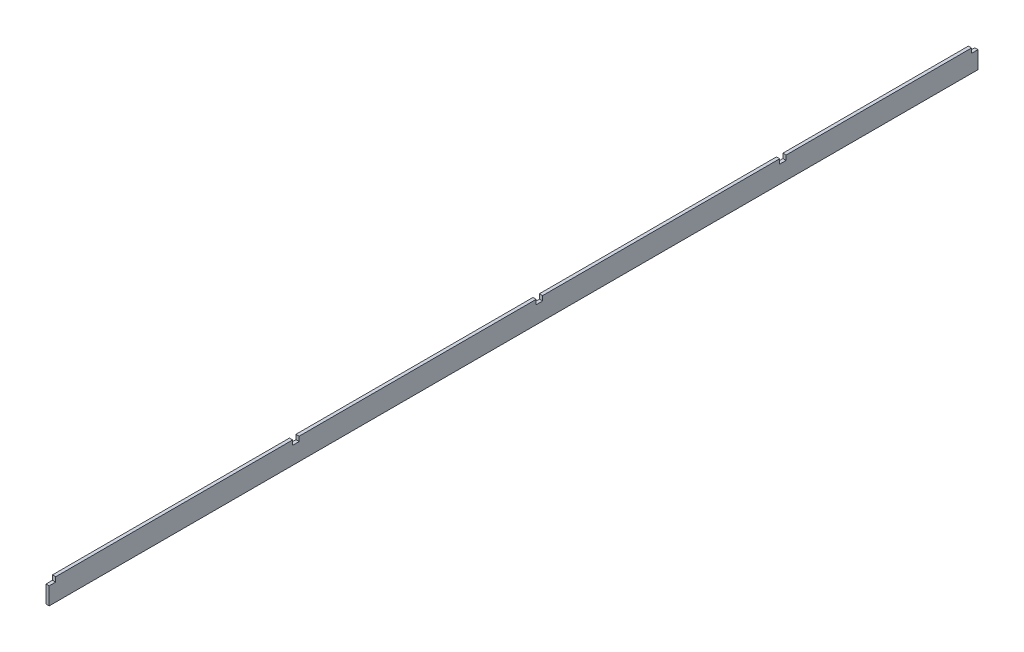
ISO-10303-21;
HEADER;
FILE_DESCRIPTION(('STEP AP214'),'2;1');
FILE_NAME('part.step','',(''),(''),'','','');
FILE_SCHEMA(('AUTOMOTIVE_DESIGN { 1 0 10303 214 1 1 1 1 }'));
ENDSEC;
DATA;
#1=APPLICATION_CONTEXT('core data for automotive mechanical design processes');
#2=APPLICATION_PROTOCOL_DEFINITION('international standard','automotive_design',2000,#1);
#3=PRODUCT_CONTEXT('',#1,'mechanical');
#4=PRODUCT('Part','Part','',(#3));
#5=PRODUCT_RELATED_PRODUCT_CATEGORY('part','',(#4));
#6=PRODUCT_DEFINITION_FORMATION('','',#4);
#7=PRODUCT_DEFINITION_CONTEXT('part definition',#1,'design');
#8=PRODUCT_DEFINITION('design','',#6,#7);
#9=PRODUCT_DEFINITION_SHAPE('','',#8);
#10=(LENGTH_UNIT() NAMED_UNIT(*) SI_UNIT(.MILLI.,.METRE.));
#11=(NAMED_UNIT(*) PLANE_ANGLE_UNIT() SI_UNIT($,.RADIAN.));
#12=(NAMED_UNIT(*) SI_UNIT($,.STERADIAN.) SOLID_ANGLE_UNIT());
#13=UNCERTAINTY_MEASURE_WITH_UNIT(LENGTH_MEASURE(1.E-05),#10,'distance_accuracy_value','');
#14=(GEOMETRIC_REPRESENTATION_CONTEXT(3) GLOBAL_UNCERTAINTY_ASSIGNED_CONTEXT((#13)) GLOBAL_UNIT_ASSIGNED_CONTEXT((#10,
#11,#12)) REPRESENTATION_CONTEXT('',''));
#15=CARTESIAN_POINT('',(0.,0.,0.));
#16=DIRECTION('',(0.,0.,1.));
#17=DIRECTION('',(1.,0.,0.));
#18=AXIS2_PLACEMENT_3D('',#15,#16,#17);
#19=CARTESIAN_POINT('',(795.106629248693,137.283876295924,123.03125));
#20=DIRECTION('',(0.,0.,-1.));
#21=DIRECTION('',(1.,0.,0.));
#22=AXIS2_PLACEMENT_3D('',#19,#20,#21);
#23=PLANE('',#22);
#24=DIRECTION('',(0.,1.,0.));
#25=VECTOR('',#24,1.);
#26=CARTESIAN_POINT('',(337.777897230405,137.283876295924,123.03125));
#27=LINE('',#26,#25);
#28=CARTESIAN_POINT('',(337.777897230405,137.283876295924,123.03125));
#29=VERTEX_POINT('',#28);
#30=CARTESIAN_POINT('',(337.777897230405,145.84143234043,123.03125));
#31=VERTEX_POINT('',#30);
#32=EDGE_CURVE('E245',#29,#31,#27,.T.);
#33=ORIENTED_EDGE('',*,*,#32,.T.);
#34=DIRECTION('',(-1.,0.,0.));
#35=VECTOR('',#34,1.);
#36=CARTESIAN_POINT('',(795.106629248693,145.84143234043,123.03125));
#37=LINE('',#36,#35);
#38=CARTESIAN_POINT('',(336.190397230405,145.84143234043,123.03125));
#39=VERTEX_POINT('',#38);
#40=EDGE_CURVE('E249',#31,#39,#37,.T.);
#41=ORIENTED_EDGE('',*,*,#40,.T.);
#42=DIRECTION('',(0.,1.,0.));
#43=VECTOR('',#42,1.);
#44=CARTESIAN_POINT('',(336.190397230405,137.283876295924,123.03125));
#45=LINE('',#44,#43);
#46=CARTESIAN_POINT('',(336.190397230405,137.283876295924,123.03125));
#47=VERTEX_POINT('',#46);
#48=EDGE_CURVE('E252',#47,#39,#45,.T.);
#49=ORIENTED_EDGE('',*,*,#48,.F.);
#50=DIRECTION('',(-1.,0.,0.));
#51=VECTOR('',#50,1.);
#52=CARTESIAN_POINT('',(795.106629248693,137.283876295924,123.03125));
#53=LINE('',#52,#51);
#54=EDGE_CURVE('E39',#29,#47,#53,.T.);
#55=ORIENTED_EDGE('',*,*,#54,.F.);
#56=EDGE_LOOP('',(#33,#41,#49,#55));
#57=FACE_BOUND('',#56,.T.);
#58=ADVANCED_FACE('F35',(#57),#23,.F.);
#59=CARTESIAN_POINT('',(795.106629248693,145.84143234043,123.03125));
#60=DIRECTION('',(0.,-1.,0.));
#61=DIRECTION('',(0.,0.,1.));
#62=AXIS2_PLACEMENT_3D('',#59,#60,#61);
#63=PLANE('',#62);
#64=DIRECTION('',(0.,0.,-1.));
#65=VECTOR('',#64,1.);
#66=CARTESIAN_POINT('',(337.777897230405,145.84143234043,123.03125));
#67=LINE('',#66,#65);
#68=CARTESIAN_POINT('',(337.777897230405,145.84143234043,119.85625));
#69=VERTEX_POINT('',#68);
#70=EDGE_CURVE('E148',#31,#69,#67,.T.);
#71=ORIENTED_EDGE('',*,*,#70,.T.);
#72=DIRECTION('',(-1.,0.,0.));
#73=VECTOR('',#72,1.);
#74=CARTESIAN_POINT('',(795.106629248693,145.84143234043,119.85625));
#75=LINE('',#74,#73);
#76=CARTESIAN_POINT('',(336.190397230405,145.84143234043,119.85625));
#77=VERTEX_POINT('',#76);
#78=EDGE_CURVE('E253',#69,#77,#75,.T.);
#79=ORIENTED_EDGE('',*,*,#78,.T.);
#80=DIRECTION('',(0.,0.,-1.));
#81=VECTOR('',#80,1.);
#82=CARTESIAN_POINT('',(336.190397230405,145.84143234043,123.03125));
#83=LINE('',#82,#81);
#84=EDGE_CURVE('E139',#39,#77,#83,.T.);
#85=ORIENTED_EDGE('',*,*,#84,.F.);
#86=ORIENTED_EDGE('',*,*,#40,.F.);
#87=EDGE_LOOP('',(#71,#79,#85,#86));
#88=FACE_BOUND('',#87,.T.);
#89=ADVANCED_FACE('F351',(#88),#63,.F.);
#90=CARTESIAN_POINT('',(795.106629248693,145.84143234043,119.85625));
#91=DIRECTION('',(0.,0.,-1.));
#92=DIRECTION('',(1.,0.,0.));
#93=AXIS2_PLACEMENT_3D('',#90,#91,#92);
#94=PLANE('',#93);
#95=DIRECTION('',(0.,1.,0.));
#96=VECTOR('',#95,1.);
#97=CARTESIAN_POINT('',(337.777897230405,145.84143234043,119.85625));
#98=LINE('',#97,#96);
#99=CARTESIAN_POINT('',(337.777897230405,148.134181796479,119.85625));
#100=VERTEX_POINT('',#99);
#101=EDGE_CURVE('E241',#69,#100,#98,.T.);
#102=ORIENTED_EDGE('',*,*,#101,.T.);
#103=DIRECTION('',(-1.,0.,0.));
#104=VECTOR('',#103,1.);
#105=CARTESIAN_POINT('',(795.106629248693,148.134181796479,119.85625));
#106=LINE('',#105,#104);
#107=CARTESIAN_POINT('',(336.190397230405,148.134181796479,119.85625));
#108=VERTEX_POINT('',#107);
#109=EDGE_CURVE('E256',#100,#108,#106,.T.);
#110=ORIENTED_EDGE('',*,*,#109,.T.);
#111=DIRECTION('',(0.,1.,0.));
#112=VECTOR('',#111,1.);
#113=CARTESIAN_POINT('',(336.190397230405,145.84143234043,119.85625));
#114=LINE('',#113,#112);
#115=EDGE_CURVE('E255',#77,#108,#114,.T.);
#116=ORIENTED_EDGE('',*,*,#115,.F.);
#117=ORIENTED_EDGE('',*,*,#78,.F.);
#118=EDGE_LOOP('',(#102,#110,#116,#117));
#119=FACE_BOUND('',#118,.T.);
#120=ADVANCED_FACE('F354',(#119),#94,.F.);
#121=CARTESIAN_POINT('',(795.106629248693,148.134181796479,119.85625));
#122=DIRECTION('',(0.,-1.,0.));
#123=DIRECTION('',(0.,0.,1.));
#124=AXIS2_PLACEMENT_3D('',#121,#122,#123);
#125=PLANE('',#124);
#126=DIRECTION('',(0.,0.,-1.));
#127=VECTOR('',#126,1.);
#128=CARTESIAN_POINT('',(337.777897230405,148.134181796479,119.85625));
#129=LINE('',#128,#127);
#130=CARTESIAN_POINT('',(337.777897230405,148.134181796479,3.17499999999987));
#131=VERTEX_POINT('',#130);
#132=EDGE_CURVE('E238',#100,#131,#129,.T.);
#133=ORIENTED_EDGE('',*,*,#132,.T.);
#134=DIRECTION('',(-1.,0.,0.));
#135=VECTOR('',#134,1.);
#136=CARTESIAN_POINT('',(795.106629248693,148.134181796479,3.17499999999987));
#137=LINE('',#136,#135);
#138=CARTESIAN_POINT('',(336.190397230405,148.134181796479,3.17499999999987));
#139=VERTEX_POINT('',#138);
#140=EDGE_CURVE('E260',#131,#139,#137,.T.);
#141=ORIENTED_EDGE('',*,*,#140,.T.);
#142=DIRECTION('',(0.,0.,-1.));
#143=VECTOR('',#142,1.);
#144=CARTESIAN_POINT('',(336.190397230405,148.134181796479,119.85625));
#145=LINE('',#144,#143);
#146=EDGE_CURVE('E259',#108,#139,#145,.T.);
#147=ORIENTED_EDGE('',*,*,#146,.F.);
#148=ORIENTED_EDGE('',*,*,#109,.F.);
#149=EDGE_LOOP('',(#133,#141,#147,#148));
#150=FACE_BOUND('',#149,.T.);
#151=ADVANCED_FACE('F372',(#150),#125,.F.);
#152=CARTESIAN_POINT('',(795.106629248693,145.84143234043,3.17499999999998));
#153=DIRECTION('',(0.,0.,1.));
#154=DIRECTION('',(0.,1.,0.));
#155=AXIS2_PLACEMENT_3D('',#152,#153,#154);
#156=PLANE('',#155);
#157=DIRECTION('',(0.,-1.,0.));
#158=VECTOR('',#157,1.);
#159=CARTESIAN_POINT('',(337.777897230405,145.84143234043,3.17499999999998));
#160=LINE('',#159,#158);
#161=CARTESIAN_POINT('',(337.777897230405,145.84143234043,3.17499999999998));
#162=VERTEX_POINT('',#161);
#163=EDGE_CURVE('E235',#131,#162,#160,.T.);
#164=ORIENTED_EDGE('',*,*,#163,.T.);
#165=DIRECTION('',(-1.,0.,0.));
#166=VECTOR('',#165,1.);
#167=CARTESIAN_POINT('',(795.106629248693,145.84143234043,3.17499999999998));
#168=LINE('',#167,#166);
#169=CARTESIAN_POINT('',(336.190397230405,145.84143234043,3.17499999999998));
#170=VERTEX_POINT('',#169);
#171=EDGE_CURVE('E264',#162,#170,#168,.T.);
#172=ORIENTED_EDGE('',*,*,#171,.T.);
#173=DIRECTION('',(0.,-1.,0.));
#174=VECTOR('',#173,1.);
#175=CARTESIAN_POINT('',(336.190397230405,145.84143234043,3.17499999999998));
#176=LINE('',#175,#174);
#177=EDGE_CURVE('E263',#139,#170,#176,.T.);
#178=ORIENTED_EDGE('',*,*,#177,.F.);
#179=ORIENTED_EDGE('',*,*,#140,.F.);
#180=EDGE_LOOP('',(#164,#172,#178,#179));
#181=FACE_BOUND('',#180,.T.);
#182=ADVANCED_FACE('F375',(#181),#156,.F.);
#183=CARTESIAN_POINT('',(795.106629248693,145.84143234043,0.));
#184=DIRECTION('',(0.,-1.,0.));
#185=DIRECTION('',(0.,0.,1.));
#186=AXIS2_PLACEMENT_3D('',#183,#184,#185);
#187=PLANE('',#186);
#188=DIRECTION('',(0.,0.,-1.));
#189=VECTOR('',#188,1.);
#190=CARTESIAN_POINT('',(337.777897230405,145.84143234043,0.));
#191=LINE('',#190,#189);
#192=CARTESIAN_POINT('',(337.777897230405,145.84143234043,0.));
#193=VERTEX_POINT('',#192);
#194=EDGE_CURVE('E232',#162,#193,#191,.T.);
#195=ORIENTED_EDGE('',*,*,#194,.T.);
#196=DIRECTION('',(-1.,0.,0.));
#197=VECTOR('',#196,1.);
#198=CARTESIAN_POINT('',(795.106629248693,145.84143234043,0.));
#199=LINE('',#198,#197);
#200=CARTESIAN_POINT('',(336.190397230405,145.84143234043,0.));
#201=VERTEX_POINT('',#200);
#202=EDGE_CURVE('E268',#193,#201,#199,.T.);
#203=ORIENTED_EDGE('',*,*,#202,.T.);
#204=DIRECTION('',(0.,0.,-1.));
#205=VECTOR('',#204,1.);
#206=CARTESIAN_POINT('',(336.190397230405,145.84143234043,0.));
#207=LINE('',#206,#205);
#208=EDGE_CURVE('E267',#170,#201,#207,.T.);
#209=ORIENTED_EDGE('',*,*,#208,.F.);
#210=ORIENTED_EDGE('',*,*,#171,.F.);
#211=EDGE_LOOP('',(#195,#203,#209,#210));
#212=FACE_BOUND('',#211,.T.);
#213=ADVANCED_FACE('F379',(#212),#187,.F.);
#214=CARTESIAN_POINT('',(795.106629248693,145.84143234043,0.));
#215=DIRECTION('',(0.,0.,-1.));
#216=DIRECTION('',(1.,0.,0.));
#217=AXIS2_PLACEMENT_3D('',#214,#215,#216);
#218=PLANE('',#217);
#219=DIRECTION('',(0.,1.,0.));
#220=VECTOR('',#219,1.);
#221=CARTESIAN_POINT('',(337.777897230405,145.84143234043,0.));
#222=LINE('',#221,#220);
#223=CARTESIAN_POINT('',(337.777897230405,148.134181796479,0.));
#224=VERTEX_POINT('',#223);
#225=EDGE_CURVE('E229',#193,#224,#222,.T.);
#226=ORIENTED_EDGE('',*,*,#225,.T.);
#227=DIRECTION('',(-1.,0.,0.));
#228=VECTOR('',#227,1.);
#229=CARTESIAN_POINT('',(795.106629248693,148.134181796479,0.));
#230=LINE('',#229,#228);
#231=CARTESIAN_POINT('',(336.190397230405,148.134181796479,0.));
#232=VERTEX_POINT('',#231);
#233=EDGE_CURVE('E272',#224,#232,#230,.T.);
#234=ORIENTED_EDGE('',*,*,#233,.T.);
#235=DIRECTION('',(0.,1.,0.));
#236=VECTOR('',#235,1.);
#237=CARTESIAN_POINT('',(336.190397230405,145.84143234043,0.));
#238=LINE('',#237,#236);
#239=EDGE_CURVE('E271',#201,#232,#238,.T.);
#240=ORIENTED_EDGE('',*,*,#239,.F.);
#241=ORIENTED_EDGE('',*,*,#202,.F.);
#242=EDGE_LOOP('',(#226,#234,#240,#241));
#243=FACE_BOUND('',#242,.T.);
#244=ADVANCED_FACE('F383',(#243),#218,.F.);
#245=CARTESIAN_POINT('',(795.106629248693,148.134181796479,0.));
#246=DIRECTION('',(0.,-1.,0.));
#247=DIRECTION('',(0.,0.,1.));
#248=AXIS2_PLACEMENT_3D('',#245,#246,#247);
#249=PLANE('',#248);
#250=DIRECTION('',(0.,0.,-1.));
#251=VECTOR('',#250,1.);
#252=CARTESIAN_POINT('',(337.777897230405,148.134181796479,0.));
#253=LINE('',#252,#251);
#254=CARTESIAN_POINT('',(337.777897230405,148.134181796479,-116.68125));
#255=VERTEX_POINT('',#254);
#256=EDGE_CURVE('E226',#224,#255,#253,.T.);
#257=ORIENTED_EDGE('',*,*,#256,.T.);
#258=DIRECTION('',(-1.,0.,0.));
#259=VECTOR('',#258,1.);
#260=CARTESIAN_POINT('',(795.106629248693,148.134181796479,-116.68125));
#261=LINE('',#260,#259);
#262=CARTESIAN_POINT('',(336.190397230405,148.134181796479,-116.68125));
#263=VERTEX_POINT('',#262);
#264=EDGE_CURVE('E276',#255,#263,#261,.T.);
#265=ORIENTED_EDGE('',*,*,#264,.T.);
#266=DIRECTION('',(0.,0.,-1.));
#267=VECTOR('',#266,1.);
#268=CARTESIAN_POINT('',(336.190397230405,148.134181796479,0.));
#269=LINE('',#268,#267);
#270=EDGE_CURVE('E275',#232,#263,#269,.T.);
#271=ORIENTED_EDGE('',*,*,#270,.F.);
#272=ORIENTED_EDGE('',*,*,#233,.F.);
#273=EDGE_LOOP('',(#257,#265,#271,#272));
#274=FACE_BOUND('',#273,.T.);
#275=ADVANCED_FACE('F387',(#274),#249,.F.);
#276=CARTESIAN_POINT('',(795.106629248693,145.84143234043,-116.68125));
#277=DIRECTION('',(0.,0.,1.));
#278=DIRECTION('',(0.,1.,0.));
#279=AXIS2_PLACEMENT_3D('',#276,#277,#278);
#280=PLANE('',#279);
#281=DIRECTION('',(0.,-1.,0.));
#282=VECTOR('',#281,1.);
#283=CARTESIAN_POINT('',(337.777897230405,145.84143234043,-116.68125));
#284=LINE('',#283,#282);
#285=CARTESIAN_POINT('',(337.777897230405,145.84143234043,-116.68125));
#286=VERTEX_POINT('',#285);
#287=EDGE_CURVE('E223',#255,#286,#284,.T.);
#288=ORIENTED_EDGE('',*,*,#287,.T.);
#289=DIRECTION('',(-1.,0.,0.));
#290=VECTOR('',#289,1.);
#291=CARTESIAN_POINT('',(795.106629248693,145.84143234043,-116.68125));
#292=LINE('',#291,#290);
#293=CARTESIAN_POINT('',(336.190397230405,145.84143234043,-116.68125));
#294=VERTEX_POINT('',#293);
#295=EDGE_CURVE('E280',#286,#294,#292,.T.);
#296=ORIENTED_EDGE('',*,*,#295,.T.);
#297=DIRECTION('',(0.,-1.,0.));
#298=VECTOR('',#297,1.);
#299=CARTESIAN_POINT('',(336.190397230405,145.84143234043,-116.68125));
#300=LINE('',#299,#298);
#301=EDGE_CURVE('E279',#263,#294,#300,.T.);
#302=ORIENTED_EDGE('',*,*,#301,.F.);
#303=ORIENTED_EDGE('',*,*,#264,.F.);
#304=EDGE_LOOP('',(#288,#296,#302,#303));
#305=FACE_BOUND('',#304,.T.);
#306=ADVANCED_FACE('F391',(#305),#280,.F.);
#307=CARTESIAN_POINT('',(795.106629248693,145.84143234043,-119.85625));
#308=DIRECTION('',(0.,-1.,0.));
#309=DIRECTION('',(0.,0.,1.));
#310=AXIS2_PLACEMENT_3D('',#307,#308,#309);
#311=PLANE('',#310);
#312=DIRECTION('',(0.,0.,-1.));
#313=VECTOR('',#312,1.);
#314=CARTESIAN_POINT('',(337.777897230405,145.84143234043,-119.85625));
#315=LINE('',#314,#313);
#316=CARTESIAN_POINT('',(337.777897230405,145.84143234043,-119.85625));
#317=VERTEX_POINT('',#316);
#318=EDGE_CURVE('E220',#286,#317,#315,.T.);
#319=ORIENTED_EDGE('',*,*,#318,.T.);
#320=DIRECTION('',(-1.,0.,0.));
#321=VECTOR('',#320,1.);
#322=CARTESIAN_POINT('',(795.106629248693,145.84143234043,-119.85625));
#323=LINE('',#322,#321);
#324=CARTESIAN_POINT('',(336.190397230405,145.84143234043,-119.85625));
#325=VERTEX_POINT('',#324);
#326=EDGE_CURVE('E284',#317,#325,#323,.T.);
#327=ORIENTED_EDGE('',*,*,#326,.T.);
#328=DIRECTION('',(0.,0.,-1.));
#329=VECTOR('',#328,1.);
#330=CARTESIAN_POINT('',(336.190397230405,145.84143234043,-119.85625));
#331=LINE('',#330,#329);
#332=EDGE_CURVE('E283',#294,#325,#331,.T.);
#333=ORIENTED_EDGE('',*,*,#332,.F.);
#334=ORIENTED_EDGE('',*,*,#295,.F.);
#335=EDGE_LOOP('',(#319,#327,#333,#334));
#336=FACE_BOUND('',#335,.T.);
#337=ADVANCED_FACE('F395',(#336),#311,.F.);
#338=CARTESIAN_POINT('',(795.106629248693,145.84143234043,-119.85625));
#339=DIRECTION('',(0.,0.,-1.));
#340=DIRECTION('',(1.,0.,0.));
#341=AXIS2_PLACEMENT_3D('',#338,#339,#340);
#342=PLANE('',#341);
#343=DIRECTION('',(0.,1.,0.));
#344=VECTOR('',#343,1.);
#345=CARTESIAN_POINT('',(337.777897230405,145.84143234043,-119.85625));
#346=LINE('',#345,#344);
#347=CARTESIAN_POINT('',(337.777897230405,148.134181796479,-119.85625));
#348=VERTEX_POINT('',#347);
#349=EDGE_CURVE('E217',#317,#348,#346,.T.);
#350=ORIENTED_EDGE('',*,*,#349,.T.);
#351=DIRECTION('',(-1.,0.,0.));
#352=VECTOR('',#351,1.);
#353=CARTESIAN_POINT('',(795.106629248693,148.134181796479,-119.85625));
#354=LINE('',#353,#352);
#355=CARTESIAN_POINT('',(336.190397230405,148.134181796479,-119.85625));
#356=VERTEX_POINT('',#355);
#357=EDGE_CURVE('E288',#348,#356,#354,.T.);
#358=ORIENTED_EDGE('',*,*,#357,.T.);
#359=DIRECTION('',(0.,1.,0.));
#360=VECTOR('',#359,1.);
#361=CARTESIAN_POINT('',(336.190397230405,145.84143234043,-119.85625));
#362=LINE('',#361,#360);
#363=EDGE_CURVE('E287',#325,#356,#362,.T.);
#364=ORIENTED_EDGE('',*,*,#363,.F.);
#365=ORIENTED_EDGE('',*,*,#326,.F.);
#366=EDGE_LOOP('',(#350,#358,#364,#365));
#367=FACE_BOUND('',#366,.T.);
#368=ADVANCED_FACE('F399',(#367),#342,.F.);
#369=CARTESIAN_POINT('',(795.106629248693,148.134181796479,-119.85625));
#370=DIRECTION('',(0.,-1.,0.));
#371=DIRECTION('',(0.,0.,1.));
#372=AXIS2_PLACEMENT_3D('',#369,#370,#371);
#373=PLANE('',#372);
#374=DIRECTION('',(0.,0.,-1.));
#375=VECTOR('',#374,1.);
#376=CARTESIAN_POINT('',(337.777897230405,148.134181796479,-119.85625));
#377=LINE('',#376,#375);
#378=CARTESIAN_POINT('',(337.777897230405,148.134181796479,-236.5375));
#379=VERTEX_POINT('',#378);
#380=EDGE_CURVE('E214',#348,#379,#377,.T.);
#381=ORIENTED_EDGE('',*,*,#380,.T.);
#382=DIRECTION('',(-1.,0.,0.));
#383=VECTOR('',#382,1.);
#384=CARTESIAN_POINT('',(795.106629248693,148.134181796479,-236.5375));
#385=LINE('',#384,#383);
#386=CARTESIAN_POINT('',(336.190397230405,148.134181796479,-236.5375));
#387=VERTEX_POINT('',#386);
#388=EDGE_CURVE('E292',#379,#387,#385,.T.);
#389=ORIENTED_EDGE('',*,*,#388,.T.);
#390=DIRECTION('',(0.,0.,-1.));
#391=VECTOR('',#390,1.);
#392=CARTESIAN_POINT('',(336.190397230405,148.134181796479,-119.85625));
#393=LINE('',#392,#391);
#394=EDGE_CURVE('E291',#356,#387,#393,.T.);
#395=ORIENTED_EDGE('',*,*,#394,.F.);
#396=ORIENTED_EDGE('',*,*,#357,.F.);
#397=EDGE_LOOP('',(#381,#389,#395,#396));
#398=FACE_BOUND('',#397,.T.);
#399=ADVANCED_FACE('F403',(#398),#373,.F.);
#400=CARTESIAN_POINT('',(795.106629248693,145.84143234043,-236.5375));
#401=DIRECTION('',(0.,0.,1.));
#402=DIRECTION('',(0.,1.,0.));
#403=AXIS2_PLACEMENT_3D('',#400,#401,#402);
#404=PLANE('',#403);
#405=DIRECTION('',(0.,-1.,0.));
#406=VECTOR('',#405,1.);
#407=CARTESIAN_POINT('',(337.777897230405,145.84143234043,-236.5375));
#408=LINE('',#407,#406);
#409=CARTESIAN_POINT('',(337.777897230405,145.84143234043,-236.5375));
#410=VERTEX_POINT('',#409);
#411=EDGE_CURVE('E211',#379,#410,#408,.T.);
#412=ORIENTED_EDGE('',*,*,#411,.T.);
#413=DIRECTION('',(-1.,0.,0.));
#414=VECTOR('',#413,1.);
#415=CARTESIAN_POINT('',(795.106629248693,145.84143234043,-236.5375));
#416=LINE('',#415,#414);
#417=CARTESIAN_POINT('',(336.190397230405,145.84143234043,-236.5375));
#418=VERTEX_POINT('',#417);
#419=EDGE_CURVE('E296',#410,#418,#416,.T.);
#420=ORIENTED_EDGE('',*,*,#419,.T.);
#421=DIRECTION('',(0.,-1.,0.));
#422=VECTOR('',#421,1.);
#423=CARTESIAN_POINT('',(336.190397230405,145.84143234043,-236.5375));
#424=LINE('',#423,#422);
#425=EDGE_CURVE('E295',#387,#418,#424,.T.);
#426=ORIENTED_EDGE('',*,*,#425,.F.);
#427=ORIENTED_EDGE('',*,*,#388,.F.);
#428=EDGE_LOOP('',(#412,#420,#426,#427));
#429=FACE_BOUND('',#428,.T.);
#430=ADVANCED_FACE('F407',(#429),#404,.F.);
#431=CARTESIAN_POINT('',(795.106629248693,145.84143234043,-239.7125));
#432=DIRECTION('',(0.,-1.,0.));
#433=DIRECTION('',(0.,0.,1.));
#434=AXIS2_PLACEMENT_3D('',#431,#432,#433);
#435=PLANE('',#434);
#436=DIRECTION('',(0.,0.,-1.));
#437=VECTOR('',#436,1.);
#438=CARTESIAN_POINT('',(337.777897230405,145.84143234043,-239.7125));
#439=LINE('',#438,#437);
#440=CARTESIAN_POINT('',(337.777897230405,145.84143234043,-239.7125));
#441=VERTEX_POINT('',#440);
#442=EDGE_CURVE('E208',#410,#441,#439,.T.);
#443=ORIENTED_EDGE('',*,*,#442,.T.);
#444=DIRECTION('',(-1.,0.,0.));
#445=VECTOR('',#444,1.);
#446=CARTESIAN_POINT('',(795.106629248693,145.84143234043,-239.7125));
#447=LINE('',#446,#445);
#448=CARTESIAN_POINT('',(336.190397230405,145.84143234043,-239.7125));
#449=VERTEX_POINT('',#448);
#450=EDGE_CURVE('E300',#441,#449,#447,.T.);
#451=ORIENTED_EDGE('',*,*,#450,.T.);
#452=DIRECTION('',(0.,0.,-1.));
#453=VECTOR('',#452,1.);
#454=CARTESIAN_POINT('',(336.190397230405,145.84143234043,-239.7125));
#455=LINE('',#454,#453);
#456=EDGE_CURVE('E299',#418,#449,#455,.T.);
#457=ORIENTED_EDGE('',*,*,#456,.F.);
#458=ORIENTED_EDGE('',*,*,#419,.F.);
#459=EDGE_LOOP('',(#443,#451,#457,#458));
#460=FACE_BOUND('',#459,.T.);
#461=ADVANCED_FACE('F411',(#460),#435,.F.);
#462=CARTESIAN_POINT('',(795.106629248693,145.84143234043,-239.7125));
#463=DIRECTION('',(0.,0.,-1.));
#464=DIRECTION('',(1.,0.,0.));
#465=AXIS2_PLACEMENT_3D('',#462,#463,#464);
#466=PLANE('',#465);
#467=DIRECTION('',(0.,1.,0.));
#468=VECTOR('',#467,1.);
#469=CARTESIAN_POINT('',(337.777897230405,145.84143234043,-239.7125));
#470=LINE('',#469,#468);
#471=CARTESIAN_POINT('',(337.777897230405,148.134181796479,-239.7125));
#472=VERTEX_POINT('',#471);
#473=EDGE_CURVE('E205',#441,#472,#470,.T.);
#474=ORIENTED_EDGE('',*,*,#473,.T.);
#475=DIRECTION('',(-1.,0.,0.));
#476=VECTOR('',#475,1.);
#477=CARTESIAN_POINT('',(795.106629248693,148.134181796479,-239.7125));
#478=LINE('',#477,#476);
#479=CARTESIAN_POINT('',(336.190397230405,148.134181796479,-239.7125));
#480=VERTEX_POINT('',#479);
#481=EDGE_CURVE('E304',#472,#480,#478,.T.);
#482=ORIENTED_EDGE('',*,*,#481,.T.);
#483=DIRECTION('',(0.,1.,0.));
#484=VECTOR('',#483,1.);
#485=CARTESIAN_POINT('',(336.190397230405,145.84143234043,-239.7125));
#486=LINE('',#485,#484);
#487=EDGE_CURVE('E303',#449,#480,#486,.T.);
#488=ORIENTED_EDGE('',*,*,#487,.F.);
#489=ORIENTED_EDGE('',*,*,#450,.F.);
#490=EDGE_LOOP('',(#474,#482,#488,#489));
#491=FACE_BOUND('',#490,.T.);
#492=ADVANCED_FACE('F415',(#491),#466,.F.);
#493=CARTESIAN_POINT('',(795.106629248693,148.134181796479,-239.7125));
#494=DIRECTION('',(0.,-1.,0.));
#495=DIRECTION('',(0.,0.,1.));
#496=AXIS2_PLACEMENT_3D('',#493,#494,#495);
#497=PLANE('',#496);
#498=DIRECTION('',(0.,0.,-1.));
#499=VECTOR('',#498,1.);
#500=CARTESIAN_POINT('',(337.777897230405,148.134181796479,-239.7125));
#501=LINE('',#500,#499);
#502=CARTESIAN_POINT('',(337.777897230405,148.134181796479,-330.99375));
#503=VERTEX_POINT('',#502);
#504=EDGE_CURVE('E199',#472,#503,#501,.T.);
#505=ORIENTED_EDGE('',*,*,#504,.T.);
#506=DIRECTION('',(-1.,0.,0.));
#507=VECTOR('',#506,1.);
#508=CARTESIAN_POINT('',(795.106629248693,148.134181796479,-330.99375));
#509=LINE('',#508,#507);
#510=CARTESIAN_POINT('',(336.190397230405,148.134181796479,-330.99375));
#511=VERTEX_POINT('',#510);
#512=EDGE_CURVE('E308',#503,#511,#509,.T.);
#513=ORIENTED_EDGE('',*,*,#512,.T.);
#514=DIRECTION('',(0.,0.,-1.));
#515=VECTOR('',#514,1.);
#516=CARTESIAN_POINT('',(336.190397230405,148.134181796479,-239.7125));
#517=LINE('',#516,#515);
#518=EDGE_CURVE('E307',#480,#511,#517,.T.);
#519=ORIENTED_EDGE('',*,*,#518,.F.);
#520=ORIENTED_EDGE('',*,*,#481,.F.);
#521=EDGE_LOOP('',(#505,#513,#519,#520));
#522=FACE_BOUND('',#521,.T.);
#523=ADVANCED_FACE('F419',(#522),#497,.F.);
#524=CARTESIAN_POINT('',(795.106629248693,148.134181796479,-330.99375));
#525=DIRECTION('',(0.,0.,1.));
#526=DIRECTION('',(-1.,0.,0.));
#527=AXIS2_PLACEMENT_3D('',#524,#525,#526);
#528=PLANE('',#527);
#529=DIRECTION('',(0.,-1.,0.));
#530=VECTOR('',#529,1.);
#531=CARTESIAN_POINT('',(337.777897230405,148.134181796479,-330.99375));
#532=LINE('',#531,#530);
#533=CARTESIAN_POINT('',(337.777897230405,145.84143234043,-330.99375));
#534=VERTEX_POINT('',#533);
#535=EDGE_CURVE('E197',#503,#534,#532,.T.);
#536=ORIENTED_EDGE('',*,*,#535,.T.);
#537=DIRECTION('',(-1.,0.,0.));
#538=VECTOR('',#537,1.);
#539=CARTESIAN_POINT('',(795.106629248693,145.84143234043,-330.99375));
#540=LINE('',#539,#538);
#541=CARTESIAN_POINT('',(336.190397230405,145.84143234043,-330.99375));
#542=VERTEX_POINT('',#541);
#543=EDGE_CURVE('E195',#534,#542,#540,.T.);
#544=ORIENTED_EDGE('',*,*,#543,.T.);
#545=DIRECTION('',(0.,-1.,0.));
#546=VECTOR('',#545,1.);
#547=CARTESIAN_POINT('',(336.190397230405,148.134181796479,-330.99375));
#548=LINE('',#547,#546);
#549=EDGE_CURVE('E311',#511,#542,#548,.T.);
#550=ORIENTED_EDGE('',*,*,#549,.F.);
#551=ORIENTED_EDGE('',*,*,#512,.F.);
#552=EDGE_LOOP('',(#536,#544,#550,#551));
#553=FACE_BOUND('',#552,.T.);
#554=ADVANCED_FACE('F423',(#553),#528,.F.);
#555=CARTESIAN_POINT('',(795.106629248693,145.84143234043,-334.16875));
#556=DIRECTION('',(0.,-1.,0.));
#557=DIRECTION('',(0.,0.,1.));
#558=AXIS2_PLACEMENT_3D('',#555,#556,#557);
#559=PLANE('',#558);
#560=DIRECTION('',(0.,0.,-1.));
#561=VECTOR('',#560,1.);
#562=CARTESIAN_POINT('',(337.777897230405,145.84143234043,-334.16875));
#563=LINE('',#562,#561);
#564=CARTESIAN_POINT('',(337.777897230405,145.84143234043,-334.16875));
#565=VERTEX_POINT('',#564);
#566=EDGE_CURVE('E44',#534,#565,#563,.T.);
#567=ORIENTED_EDGE('',*,*,#566,.T.);
#568=DIRECTION('',(-1.,0.,0.));
#569=VECTOR('',#568,1.);
#570=CARTESIAN_POINT('',(795.106629248693,145.84143234043,-334.16875));
#571=LINE('',#570,#569);
#572=CARTESIAN_POINT('',(336.190397230405,145.84143234043,-334.16875));
#573=VERTEX_POINT('',#572);
#574=EDGE_CURVE('E186',#565,#573,#571,.T.);
#575=ORIENTED_EDGE('',*,*,#574,.T.);
#576=DIRECTION('',(0.,0.,-1.));
#577=VECTOR('',#576,1.);
#578=CARTESIAN_POINT('',(336.190397230405,145.84143234043,-334.16875));
#579=LINE('',#578,#577);
#580=EDGE_CURVE('E191',#542,#573,#579,.T.);
#581=ORIENTED_EDGE('',*,*,#580,.F.);
#582=ORIENTED_EDGE('',*,*,#543,.F.);
#583=EDGE_LOOP('',(#567,#575,#581,#582));
#584=FACE_BOUND('',#583,.T.);
#585=ADVANCED_FACE('F193',(#584),#559,.F.);
#586=CARTESIAN_POINT('',(795.106629248693,137.283876295924,-334.16875));
#587=DIRECTION('',(0.,0.,1.));
#588=DIRECTION('',(-1.,0.,0.));
#589=AXIS2_PLACEMENT_3D('',#586,#587,#588);
#590=PLANE('',#589);
#591=DIRECTION('',(0.,-1.,0.));
#592=VECTOR('',#591,1.);
#593=CARTESIAN_POINT('',(337.777897230405,137.283876295924,-334.16875));
#594=LINE('',#593,#592);
#595=CARTESIAN_POINT('',(337.777897230405,137.283876295924,-334.16875));
#596=VERTEX_POINT('',#595);
#597=EDGE_CURVE('E11',#565,#596,#594,.T.);
#598=ORIENTED_EDGE('',*,*,#597,.T.);
#599=DIRECTION('',(-1.,0.,0.));
#600=VECTOR('',#599,1.);
#601=CARTESIAN_POINT('',(795.106629248693,137.283876295924,-334.16875));
#602=LINE('',#601,#600);
#603=CARTESIAN_POINT('',(336.190397230405,137.283876295924,-334.16875));
#604=VERTEX_POINT('',#603);
#605=EDGE_CURVE('E312',#596,#604,#602,.T.);
#606=ORIENTED_EDGE('',*,*,#605,.T.);
#607=DIRECTION('',(0.,-1.,0.));
#608=VECTOR('',#607,1.);
#609=CARTESIAN_POINT('',(336.190397230405,137.283876295924,-334.16875));
#610=LINE('',#609,#608);
#611=EDGE_CURVE('E188',#573,#604,#610,.T.);
#612=ORIENTED_EDGE('',*,*,#611,.F.);
#613=ORIENTED_EDGE('',*,*,#574,.F.);
#614=EDGE_LOOP('',(#598,#606,#612,#613));
#615=FACE_BOUND('',#614,.T.);
#616=ADVANCED_FACE('F187',(#615),#590,.F.);
#617=CARTESIAN_POINT('',(795.106629248693,137.283876295924,119.85625));
#618=DIRECTION('',(0.,1.,0.));
#619=DIRECTION('',(0.,0.,-1.));
#620=AXIS2_PLACEMENT_3D('',#617,#618,#619);
#621=PLANE('',#620);
#622=DIRECTION('',(0.,0.,1.));
#623=VECTOR('',#622,1.);
#624=CARTESIAN_POINT('',(337.777897230405,137.283876295924,119.85625));
#625=LINE('',#624,#623);
#626=EDGE_CURVE('E52',#596,#29,#625,.T.);
#627=ORIENTED_EDGE('',*,*,#626,.T.);
#628=ORIENTED_EDGE('',*,*,#54,.T.);
#629=DIRECTION('',(0.,0.,1.));
#630=VECTOR('',#629,1.);
#631=CARTESIAN_POINT('',(336.190397230405,137.283876295924,119.85625));
#632=LINE('',#631,#630);
#633=EDGE_CURVE('E58',#604,#47,#632,.T.);
#634=ORIENTED_EDGE('',*,*,#633,.F.);
#635=ORIENTED_EDGE('',*,*,#605,.F.);
#636=EDGE_LOOP('',(#627,#628,#634,#635));
#637=FACE_BOUND('',#636,.T.);
#638=ADVANCED_FACE('F349',(#637),#621,.F.);
#639=CARTESIAN_POINT('',(336.190397230405,0.,0.));
#640=DIRECTION('',(1.,0.,0.));
#641=DIRECTION('',(0.,0.,1.));
#642=AXIS2_PLACEMENT_3D('',#639,#640,#641);
#643=PLANE('',#642);
#644=ORIENTED_EDGE('',*,*,#48,.T.);
#645=ORIENTED_EDGE('',*,*,#84,.T.);
#646=ORIENTED_EDGE('',*,*,#115,.T.);
#647=ORIENTED_EDGE('',*,*,#146,.T.);
#648=ORIENTED_EDGE('',*,*,#177,.T.);
#649=ORIENTED_EDGE('',*,*,#208,.T.);
#650=ORIENTED_EDGE('',*,*,#239,.T.);
#651=ORIENTED_EDGE('',*,*,#270,.T.);
#652=ORIENTED_EDGE('',*,*,#301,.T.);
#653=ORIENTED_EDGE('',*,*,#332,.T.);
#654=ORIENTED_EDGE('',*,*,#363,.T.);
#655=ORIENTED_EDGE('',*,*,#394,.T.);
#656=ORIENTED_EDGE('',*,*,#425,.T.);
#657=ORIENTED_EDGE('',*,*,#456,.T.);
#658=ORIENTED_EDGE('',*,*,#487,.T.);
#659=ORIENTED_EDGE('',*,*,#518,.T.);
#660=ORIENTED_EDGE('',*,*,#549,.T.);
#661=ORIENTED_EDGE('',*,*,#580,.T.);
#662=ORIENTED_EDGE('',*,*,#611,.T.);
#663=ORIENTED_EDGE('',*,*,#633,.T.);
#664=EDGE_LOOP('',(#644,#645,#646,#647,#648,#649,#650,#651,#652,#653,#654,#655,#656,#657,#658,
#659,#660,#661,#662,#663));
#665=FACE_BOUND('',#664,.T.);
#666=ADVANCED_FACE('F356',(#665),#643,.F.);
#667=CARTESIAN_POINT('',(337.777897230405,128.21355438592,-334.16875));
#668=DIRECTION('',(1.,0.,0.));
#669=DIRECTION('',(0.,0.,1.));
#670=AXIS2_PLACEMENT_3D('',#667,#668,#669);
#671=PLANE('',#670);
#672=ORIENTED_EDGE('',*,*,#626,.F.);
#673=ORIENTED_EDGE('',*,*,#597,.F.);
#674=ORIENTED_EDGE('',*,*,#566,.F.);
#675=ORIENTED_EDGE('',*,*,#535,.F.);
#676=ORIENTED_EDGE('',*,*,#504,.F.);
#677=ORIENTED_EDGE('',*,*,#473,.F.);
#678=ORIENTED_EDGE('',*,*,#442,.F.);
#679=ORIENTED_EDGE('',*,*,#411,.F.);
#680=ORIENTED_EDGE('',*,*,#380,.F.);
#681=ORIENTED_EDGE('',*,*,#349,.F.);
#682=ORIENTED_EDGE('',*,*,#318,.F.);
#683=ORIENTED_EDGE('',*,*,#287,.F.);
#684=ORIENTED_EDGE('',*,*,#256,.F.);
#685=ORIENTED_EDGE('',*,*,#225,.F.);
#686=ORIENTED_EDGE('',*,*,#194,.F.);
#687=ORIENTED_EDGE('',*,*,#163,.F.);
#688=ORIENTED_EDGE('',*,*,#132,.F.);
#689=ORIENTED_EDGE('',*,*,#101,.F.);
#690=ORIENTED_EDGE('',*,*,#70,.F.);
#691=ORIENTED_EDGE('',*,*,#32,.F.);
#692=EDGE_LOOP('',(#672,#673,#674,#675,#676,#677,#678,#679,#680,#681,#682,#683,#684,#685,#686,
#687,#688,#689,#690,#691));
#693=FACE_BOUND('',#692,.T.);
#694=ADVANCED_FACE('F37',(#693),#671,.T.);
#695=CLOSED_SHELL('',(#58,#89,#120,#151,#182,#213,#244,#275,#306,#337,#368,#399,#430,#461,#492,
#523,#554,#585,#616,#638,#666,#694));
#696=MANIFOLD_SOLID_BREP('B2',#695);
#697=ADVANCED_BREP_SHAPE_REPRESENTATION('',(#18,#696),#14);
#698=SHAPE_DEFINITION_REPRESENTATION(#9,#697);
ENDSEC;
END-ISO-10303-21;
